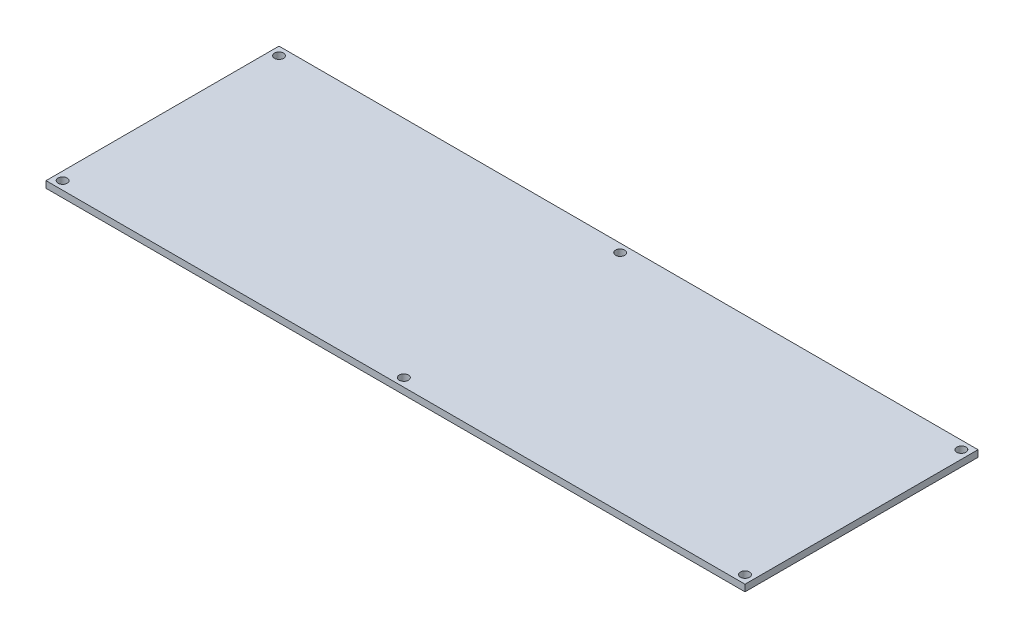
ISO-10303-21;
HEADER;
FILE_DESCRIPTION(('STEP AP214'),'2;1');
FILE_NAME('part.step','',(''),(''),'','','');
FILE_SCHEMA(('AUTOMOTIVE_DESIGN { 1 0 10303 214 1 1 1 1 }'));
ENDSEC;
DATA;
#1=APPLICATION_CONTEXT('core data for automotive mechanical design processes');
#2=APPLICATION_PROTOCOL_DEFINITION('international standard','automotive_design',2000,#1);
#3=PRODUCT_CONTEXT('',#1,'mechanical');
#4=PRODUCT('Part','Part','',(#3));
#5=PRODUCT_RELATED_PRODUCT_CATEGORY('part','',(#4));
#6=PRODUCT_DEFINITION_FORMATION('','',#4);
#7=PRODUCT_DEFINITION_CONTEXT('part definition',#1,'design');
#8=PRODUCT_DEFINITION('design','',#6,#7);
#9=PRODUCT_DEFINITION_SHAPE('','',#8);
#10=(LENGTH_UNIT() NAMED_UNIT(*) SI_UNIT(.MILLI.,.METRE.));
#11=(NAMED_UNIT(*) PLANE_ANGLE_UNIT() SI_UNIT($,.RADIAN.));
#12=(NAMED_UNIT(*) SI_UNIT($,.STERADIAN.) SOLID_ANGLE_UNIT());
#13=UNCERTAINTY_MEASURE_WITH_UNIT(LENGTH_MEASURE(1.E-05),#10,'distance_accuracy_value','');
#14=(GEOMETRIC_REPRESENTATION_CONTEXT(3) GLOBAL_UNCERTAINTY_ASSIGNED_CONTEXT((#13)) GLOBAL_UNIT_ASSIGNED_CONTEXT((#10,
#11,#12)) REPRESENTATION_CONTEXT('',''));
#15=CARTESIAN_POINT('',(0.,0.,0.));
#16=DIRECTION('',(0.,0.,1.));
#17=DIRECTION('',(1.,0.,0.));
#18=AXIS2_PLACEMENT_3D('',#15,#16,#17);
#19=CARTESIAN_POINT('',(0.,1.,0.));
#20=DIRECTION('',(0.,1.,0.));
#21=DIRECTION('',(0.,0.,1.));
#22=AXIS2_PLACEMENT_3D('',#19,#20,#21);
#23=PLANE('',#22);
#24=CARTESIAN_POINT('',(102.5,1.,32.5));
#25=DIRECTION('',(0.,1.,0.));
#26=DIRECTION('',(0.,0.,1.));
#27=AXIS2_PLACEMENT_3D('',#24,#25,#26);
#28=CIRCLE('',#27,1.375);
#29=CARTESIAN_POINT('',(102.5,1.,33.875));
#30=VERTEX_POINT('',#29);
#31=EDGE_CURVE('E133',#30,#30,#28,.T.);
#32=ORIENTED_EDGE('',*,*,#31,.F.);
#33=EDGE_LOOP('',(#32));
#34=FACE_BOUND('',#33,.T.);
#35=CARTESIAN_POINT('',(0.,1.,32.5));
#36=DIRECTION('',(0.,1.,0.));
#37=DIRECTION('',(0.,0.,1.));
#38=AXIS2_PLACEMENT_3D('',#35,#36,#37);
#39=CIRCLE('',#38,1.375);
#40=CARTESIAN_POINT('',(0.,1.,33.875));
#41=VERTEX_POINT('',#40);
#42=EDGE_CURVE('E121',#41,#41,#39,.T.);
#43=ORIENTED_EDGE('',*,*,#42,.F.);
#44=EDGE_LOOP('',(#43));
#45=FACE_BOUND('',#44,.T.);
#46=CARTESIAN_POINT('',(-102.5,1.,-32.5));
#47=DIRECTION('',(0.,1.,0.));
#48=DIRECTION('',(0.,0.,1.));
#49=AXIS2_PLACEMENT_3D('',#46,#47,#48);
#50=CIRCLE('',#49,1.375);
#51=CARTESIAN_POINT('',(-102.5,1.,-31.125));
#52=VERTEX_POINT('',#51);
#53=EDGE_CURVE('E100',#52,#52,#50,.T.);
#54=ORIENTED_EDGE('',*,*,#53,.F.);
#55=EDGE_LOOP('',(#54));
#56=FACE_BOUND('',#55,.T.);
#57=DIRECTION('',(0.,0.,-1.));
#58=VECTOR('',#57,1.);
#59=CARTESIAN_POINT('',(105.,1.,-35.));
#60=LINE('',#59,#58);
#61=CARTESIAN_POINT('',(105.,1.,35.));
#62=VERTEX_POINT('',#61);
#63=CARTESIAN_POINT('',(105.,1.,-35.));
#64=VERTEX_POINT('',#63);
#65=EDGE_CURVE('E85',#62,#64,#60,.T.);
#66=ORIENTED_EDGE('',*,*,#65,.T.);
#67=DIRECTION('',(-1.,0.,0.));
#68=VECTOR('',#67,1.);
#69=CARTESIAN_POINT('',(-105.,1.,-35.));
#70=LINE('',#69,#68);
#71=CARTESIAN_POINT('',(-105.,1.,-35.));
#72=VERTEX_POINT('',#71);
#73=EDGE_CURVE('E80',#64,#72,#70,.T.);
#74=ORIENTED_EDGE('',*,*,#73,.T.);
#75=DIRECTION('',(0.,0.,1.));
#76=VECTOR('',#75,1.);
#77=CARTESIAN_POINT('',(-105.,1.,-35.));
#78=LINE('',#77,#76);
#79=CARTESIAN_POINT('',(-105.,1.,35.));
#80=VERTEX_POINT('',#79);
#81=EDGE_CURVE('E83',#72,#80,#78,.T.);
#82=ORIENTED_EDGE('',*,*,#81,.T.);
#83=DIRECTION('',(1.,0.,0.));
#84=VECTOR('',#83,1.);
#85=CARTESIAN_POINT('',(-105.,1.,35.));
#86=LINE('',#85,#84);
#87=EDGE_CURVE('E50',#80,#62,#86,.T.);
#88=ORIENTED_EDGE('',*,*,#87,.T.);
#89=EDGE_LOOP('',(#66,#74,#82,#88));
#90=FACE_BOUND('',#89,.T.);
#91=CARTESIAN_POINT('',(-102.5,1.,32.5));
#92=DIRECTION('',(0.,1.,0.));
#93=DIRECTION('',(0.,0.,-1.));
#94=AXIS2_PLACEMENT_3D('',#91,#92,#93);
#95=CIRCLE('',#94,1.375);
#96=CARTESIAN_POINT('',(-102.5,1.,31.125));
#97=VERTEX_POINT('',#96);
#98=EDGE_CURVE('E115',#97,#97,#95,.T.);
#99=ORIENTED_EDGE('',*,*,#98,.F.);
#100=EDGE_LOOP('',(#99));
#101=FACE_BOUND('',#100,.T.);
#102=CARTESIAN_POINT('',(0.,1.,-32.5));
#103=DIRECTION('',(0.,1.,0.));
#104=DIRECTION('',(0.,0.,-1.));
#105=AXIS2_PLACEMENT_3D('',#102,#103,#104);
#106=CIRCLE('',#105,1.375);
#107=CARTESIAN_POINT('',(0.,1.,-33.875));
#108=VERTEX_POINT('',#107);
#109=EDGE_CURVE('E127',#108,#108,#106,.T.);
#110=ORIENTED_EDGE('',*,*,#109,.F.);
#111=EDGE_LOOP('',(#110));
#112=FACE_BOUND('',#111,.T.);
#113=CARTESIAN_POINT('',(102.5,1.,-32.5));
#114=DIRECTION('',(0.,1.,0.));
#115=DIRECTION('',(0.,0.,-1.));
#116=AXIS2_PLACEMENT_3D('',#113,#114,#115);
#117=CIRCLE('',#116,1.375);
#118=CARTESIAN_POINT('',(102.5,1.,-33.875));
#119=VERTEX_POINT('',#118);
#120=EDGE_CURVE('E139',#119,#119,#117,.T.);
#121=ORIENTED_EDGE('',*,*,#120,.F.);
#122=EDGE_LOOP('',(#121));
#123=FACE_BOUND('',#122,.T.);
#124=ADVANCED_FACE('F33',(#34,#45,#56,#90,#101,#112,#123),#23,.T.);
#125=CARTESIAN_POINT('',(0.,-1.,0.));
#126=DIRECTION('',(0.,1.,0.));
#127=DIRECTION('',(0.,0.,1.));
#128=AXIS2_PLACEMENT_3D('',#125,#126,#127);
#129=PLANE('',#128);
#130=DIRECTION('',(0.,0.,-1.));
#131=VECTOR('',#130,1.);
#132=CARTESIAN_POINT('',(105.,-1.,-35.));
#133=LINE('',#132,#131);
#134=CARTESIAN_POINT('',(105.,-1.,35.));
#135=VERTEX_POINT('',#134);
#136=CARTESIAN_POINT('',(105.,-1.,-35.));
#137=VERTEX_POINT('',#136);
#138=EDGE_CURVE('E97',#135,#137,#133,.T.);
#139=ORIENTED_EDGE('',*,*,#138,.F.);
#140=DIRECTION('',(1.,0.,0.));
#141=VECTOR('',#140,1.);
#142=CARTESIAN_POINT('',(-105.,-1.,35.));
#143=LINE('',#142,#141);
#144=CARTESIAN_POINT('',(-105.,-1.,35.));
#145=VERTEX_POINT('',#144);
#146=EDGE_CURVE('E73',#145,#135,#143,.T.);
#147=ORIENTED_EDGE('',*,*,#146,.F.);
#148=DIRECTION('',(0.,0.,1.));
#149=VECTOR('',#148,1.);
#150=CARTESIAN_POINT('',(-105.,-1.,-35.));
#151=LINE('',#150,#149);
#152=CARTESIAN_POINT('',(-105.,-1.,-35.));
#153=VERTEX_POINT('',#152);
#154=EDGE_CURVE('E67',#153,#145,#151,.T.);
#155=ORIENTED_EDGE('',*,*,#154,.F.);
#156=DIRECTION('',(-1.,0.,0.));
#157=VECTOR('',#156,1.);
#158=CARTESIAN_POINT('',(-105.,-1.,-35.));
#159=LINE('',#158,#157);
#160=EDGE_CURVE('E89',#137,#153,#159,.T.);
#161=ORIENTED_EDGE('',*,*,#160,.F.);
#162=EDGE_LOOP('',(#139,#147,#155,#161));
#163=FACE_BOUND('',#162,.T.);
#164=CARTESIAN_POINT('',(-102.5,-1.,-32.5));
#165=DIRECTION('',(0.,1.,0.));
#166=DIRECTION('',(0.,0.,1.));
#167=AXIS2_PLACEMENT_3D('',#164,#165,#166);
#168=CIRCLE('',#167,1.375);
#169=CARTESIAN_POINT('',(-102.5,-1.,-31.125));
#170=VERTEX_POINT('',#169);
#171=EDGE_CURVE('E112',#170,#170,#168,.T.);
#172=ORIENTED_EDGE('',*,*,#171,.T.);
#173=EDGE_LOOP('',(#172));
#174=FACE_BOUND('',#173,.T.);
#175=CARTESIAN_POINT('',(-102.5,-1.,32.5));
#176=DIRECTION('',(0.,1.,0.));
#177=DIRECTION('',(0.,0.,-1.));
#178=AXIS2_PLACEMENT_3D('',#175,#176,#177);
#179=CIRCLE('',#178,1.375);
#180=CARTESIAN_POINT('',(-102.5,-1.,31.125));
#181=VERTEX_POINT('',#180);
#182=EDGE_CURVE('E118',#181,#181,#179,.T.);
#183=ORIENTED_EDGE('',*,*,#182,.T.);
#184=EDGE_LOOP('',(#183));
#185=FACE_BOUND('',#184,.T.);
#186=CARTESIAN_POINT('',(0.,-1.,32.5));
#187=DIRECTION('',(0.,1.,0.));
#188=DIRECTION('',(0.,0.,1.));
#189=AXIS2_PLACEMENT_3D('',#186,#187,#188);
#190=CIRCLE('',#189,1.375);
#191=CARTESIAN_POINT('',(0.,-1.,33.875));
#192=VERTEX_POINT('',#191);
#193=EDGE_CURVE('E124',#192,#192,#190,.T.);
#194=ORIENTED_EDGE('',*,*,#193,.T.);
#195=EDGE_LOOP('',(#194));
#196=FACE_BOUND('',#195,.T.);
#197=CARTESIAN_POINT('',(0.,-1.,-32.5));
#198=DIRECTION('',(0.,1.,0.));
#199=DIRECTION('',(0.,0.,-1.));
#200=AXIS2_PLACEMENT_3D('',#197,#198,#199);
#201=CIRCLE('',#200,1.375);
#202=CARTESIAN_POINT('',(0.,-1.,-33.875));
#203=VERTEX_POINT('',#202);
#204=EDGE_CURVE('E130',#203,#203,#201,.T.);
#205=ORIENTED_EDGE('',*,*,#204,.T.);
#206=EDGE_LOOP('',(#205));
#207=FACE_BOUND('',#206,.T.);
#208=CARTESIAN_POINT('',(102.5,-1.,32.5));
#209=DIRECTION('',(0.,1.,0.));
#210=DIRECTION('',(0.,0.,1.));
#211=AXIS2_PLACEMENT_3D('',#208,#209,#210);
#212=CIRCLE('',#211,1.375);
#213=CARTESIAN_POINT('',(102.5,-1.,33.875));
#214=VERTEX_POINT('',#213);
#215=EDGE_CURVE('E136',#214,#214,#212,.T.);
#216=ORIENTED_EDGE('',*,*,#215,.T.);
#217=EDGE_LOOP('',(#216));
#218=FACE_BOUND('',#217,.T.);
#219=CARTESIAN_POINT('',(102.5,-1.,-32.5));
#220=DIRECTION('',(0.,1.,0.));
#221=DIRECTION('',(0.,0.,-1.));
#222=AXIS2_PLACEMENT_3D('',#219,#220,#221);
#223=CIRCLE('',#222,1.375);
#224=CARTESIAN_POINT('',(102.5,-1.,-33.875));
#225=VERTEX_POINT('',#224);
#226=EDGE_CURVE('E142',#225,#225,#223,.T.);
#227=ORIENTED_EDGE('',*,*,#226,.T.);
#228=EDGE_LOOP('',(#227));
#229=FACE_BOUND('',#228,.T.);
#230=ADVANCED_FACE('F108',(#163,#174,#185,#196,#207,#218,#229),#129,.F.);
#231=CARTESIAN_POINT('',(105.,1.,-35.));
#232=DIRECTION('',(-1.,0.,0.));
#233=DIRECTION('',(0.,0.,1.));
#234=AXIS2_PLACEMENT_3D('',#231,#232,#233);
#235=PLANE('',#234);
#236=ORIENTED_EDGE('',*,*,#138,.T.);
#237=DIRECTION('',(0.,-1.,0.));
#238=VECTOR('',#237,1.);
#239=CARTESIAN_POINT('',(105.,1.,-35.));
#240=LINE('',#239,#238);
#241=EDGE_CURVE('E11',#64,#137,#240,.T.);
#242=ORIENTED_EDGE('',*,*,#241,.F.);
#243=ORIENTED_EDGE('',*,*,#65,.F.);
#244=DIRECTION('',(0.,-1.,0.));
#245=VECTOR('',#244,1.);
#246=CARTESIAN_POINT('',(105.,1.,35.));
#247=LINE('',#246,#245);
#248=EDGE_CURVE('E93',#62,#135,#247,.T.);
#249=ORIENTED_EDGE('',*,*,#248,.T.);
#250=EDGE_LOOP('',(#236,#242,#243,#249));
#251=FACE_BOUND('',#250,.T.);
#252=ADVANCED_FACE('F35',(#251),#235,.F.);
#253=CARTESIAN_POINT('',(-105.,1.,-35.));
#254=DIRECTION('',(0.,0.,1.));
#255=DIRECTION('',(1.,0.,0.));
#256=AXIS2_PLACEMENT_3D('',#253,#254,#255);
#257=PLANE('',#256);
#258=ORIENTED_EDGE('',*,*,#160,.T.);
#259=DIRECTION('',(0.,-1.,0.));
#260=VECTOR('',#259,1.);
#261=CARTESIAN_POINT('',(-105.,1.,-35.));
#262=LINE('',#261,#260);
#263=EDGE_CURVE('E42',#72,#153,#262,.T.);
#264=ORIENTED_EDGE('',*,*,#263,.F.);
#265=ORIENTED_EDGE('',*,*,#73,.F.);
#266=ORIENTED_EDGE('',*,*,#241,.T.);
#267=EDGE_LOOP('',(#258,#264,#265,#266));
#268=FACE_BOUND('',#267,.T.);
#269=ADVANCED_FACE('F88',(#268),#257,.F.);
#270=CARTESIAN_POINT('',(-105.,1.,-35.));
#271=DIRECTION('',(1.,0.,0.));
#272=DIRECTION('',(0.,0.,-1.));
#273=AXIS2_PLACEMENT_3D('',#270,#271,#272);
#274=PLANE('',#273);
#275=ORIENTED_EDGE('',*,*,#154,.T.);
#276=DIRECTION('',(0.,-1.,0.));
#277=VECTOR('',#276,1.);
#278=CARTESIAN_POINT('',(-105.,1.,35.));
#279=LINE('',#278,#277);
#280=EDGE_CURVE('E90',#80,#145,#279,.T.);
#281=ORIENTED_EDGE('',*,*,#280,.F.);
#282=ORIENTED_EDGE('',*,*,#81,.F.);
#283=ORIENTED_EDGE('',*,*,#263,.T.);
#284=EDGE_LOOP('',(#275,#281,#282,#283));
#285=FACE_BOUND('',#284,.T.);
#286=ADVANCED_FACE('F91',(#285),#274,.F.);
#287=CARTESIAN_POINT('',(-105.,1.,35.));
#288=DIRECTION('',(0.,0.,-1.));
#289=DIRECTION('',(-1.,0.,0.));
#290=AXIS2_PLACEMENT_3D('',#287,#288,#289);
#291=PLANE('',#290);
#292=ORIENTED_EDGE('',*,*,#146,.T.);
#293=ORIENTED_EDGE('',*,*,#248,.F.);
#294=ORIENTED_EDGE('',*,*,#87,.F.);
#295=ORIENTED_EDGE('',*,*,#280,.T.);
#296=EDGE_LOOP('',(#292,#293,#294,#295));
#297=FACE_BOUND('',#296,.T.);
#298=ADVANCED_FACE('F105',(#297),#291,.F.);
#299=CARTESIAN_POINT('',(-102.5,1.,-32.5));
#300=DIRECTION('',(0.,-1.,0.));
#301=DIRECTION('',(0.,0.,-1.));
#302=AXIS2_PLACEMENT_3D('',#299,#300,#301);
#303=CYLINDRICAL_SURFACE('',#302,1.375);
#304=ORIENTED_EDGE('',*,*,#53,.T.);
#305=EDGE_LOOP('',(#304));
#306=FACE_BOUND('',#305,.T.);
#307=ORIENTED_EDGE('',*,*,#171,.F.);
#308=EDGE_LOOP('',(#307));
#309=FACE_BOUND('',#308,.T.);
#310=ADVANCED_FACE('F161',(#306,#309),#303,.F.);
#311=CARTESIAN_POINT('',(-102.5,1.,32.5));
#312=DIRECTION('',(0.,-1.,0.));
#313=DIRECTION('',(0.,0.,-1.));
#314=AXIS2_PLACEMENT_3D('',#311,#312,#313);
#315=CYLINDRICAL_SURFACE('',#314,1.375);
#316=ORIENTED_EDGE('',*,*,#98,.T.);
#317=EDGE_LOOP('',(#316));
#318=FACE_BOUND('',#317,.T.);
#319=ORIENTED_EDGE('',*,*,#182,.F.);
#320=EDGE_LOOP('',(#319));
#321=FACE_BOUND('',#320,.T.);
#322=ADVANCED_FACE('F207',(#318,#321),#315,.F.);
#323=CARTESIAN_POINT('',(0.,1.,32.5));
#324=DIRECTION('',(0.,-1.,0.));
#325=DIRECTION('',(0.,0.,-1.));
#326=AXIS2_PLACEMENT_3D('',#323,#324,#325);
#327=CYLINDRICAL_SURFACE('',#326,1.375);
#328=ORIENTED_EDGE('',*,*,#42,.T.);
#329=EDGE_LOOP('',(#328));
#330=FACE_BOUND('',#329,.T.);
#331=ORIENTED_EDGE('',*,*,#193,.F.);
#332=EDGE_LOOP('',(#331));
#333=FACE_BOUND('',#332,.T.);
#334=ADVANCED_FACE('F215',(#330,#333),#327,.F.);
#335=CARTESIAN_POINT('',(0.,1.,-32.5));
#336=DIRECTION('',(0.,-1.,0.));
#337=DIRECTION('',(0.,0.,-1.));
#338=AXIS2_PLACEMENT_3D('',#335,#336,#337);
#339=CYLINDRICAL_SURFACE('',#338,1.375);
#340=ORIENTED_EDGE('',*,*,#109,.T.);
#341=EDGE_LOOP('',(#340));
#342=FACE_BOUND('',#341,.T.);
#343=ORIENTED_EDGE('',*,*,#204,.F.);
#344=EDGE_LOOP('',(#343));
#345=FACE_BOUND('',#344,.T.);
#346=ADVANCED_FACE('F223',(#342,#345),#339,.F.);
#347=CARTESIAN_POINT('',(102.5,1.,32.5));
#348=DIRECTION('',(0.,-1.,0.));
#349=DIRECTION('',(0.,0.,-1.));
#350=AXIS2_PLACEMENT_3D('',#347,#348,#349);
#351=CYLINDRICAL_SURFACE('',#350,1.375);
#352=ORIENTED_EDGE('',*,*,#31,.T.);
#353=EDGE_LOOP('',(#352));
#354=FACE_BOUND('',#353,.T.);
#355=ORIENTED_EDGE('',*,*,#215,.F.);
#356=EDGE_LOOP('',(#355));
#357=FACE_BOUND('',#356,.T.);
#358=ADVANCED_FACE('F232',(#354,#357),#351,.F.);
#359=CARTESIAN_POINT('',(102.5,1.,-32.5));
#360=DIRECTION('',(0.,-1.,0.));
#361=DIRECTION('',(0.,0.,-1.));
#362=AXIS2_PLACEMENT_3D('',#359,#360,#361);
#363=CYLINDRICAL_SURFACE('',#362,1.375);
#364=ORIENTED_EDGE('',*,*,#120,.T.);
#365=EDGE_LOOP('',(#364));
#366=FACE_BOUND('',#365,.T.);
#367=ORIENTED_EDGE('',*,*,#226,.F.);
#368=EDGE_LOOP('',(#367));
#369=FACE_BOUND('',#368,.T.);
#370=ADVANCED_FACE('F148',(#366,#369),#363,.F.);
#371=CLOSED_SHELL('',(#124,#230,#252,#269,#286,#298,#310,#322,#334,#346,#358,#370));
#372=MANIFOLD_SOLID_BREP('B2',#371);
#373=ADVANCED_BREP_SHAPE_REPRESENTATION('',(#18,#372),#14);
#374=SHAPE_DEFINITION_REPRESENTATION(#9,#373);
ENDSEC;
END-ISO-10303-21;
